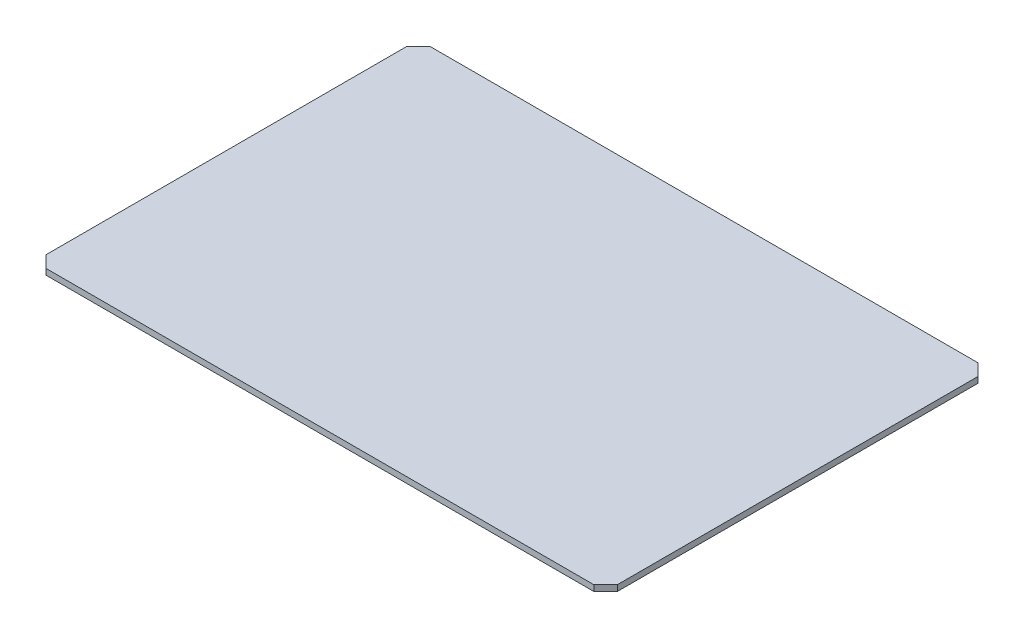
ISO-10303-21;
HEADER;
FILE_DESCRIPTION(('STEP AP214'),'2;1');
FILE_NAME('part.step','',(''),(''),'','','');
FILE_SCHEMA(('AUTOMOTIVE_DESIGN { 1 0 10303 214 1 1 1 1 }'));
ENDSEC;
DATA;
#1=APPLICATION_CONTEXT('core data for automotive mechanical design processes');
#2=APPLICATION_PROTOCOL_DEFINITION('international standard','automotive_design',2000,#1);
#3=PRODUCT_CONTEXT('',#1,'mechanical');
#4=PRODUCT('Part','Part','',(#3));
#5=PRODUCT_RELATED_PRODUCT_CATEGORY('part','',(#4));
#6=PRODUCT_DEFINITION_FORMATION('','',#4);
#7=PRODUCT_DEFINITION_CONTEXT('part definition',#1,'design');
#8=PRODUCT_DEFINITION('design','',#6,#7);
#9=PRODUCT_DEFINITION_SHAPE('','',#8);
#10=(LENGTH_UNIT() NAMED_UNIT(*) SI_UNIT(.MILLI.,.METRE.));
#11=(NAMED_UNIT(*) PLANE_ANGLE_UNIT() SI_UNIT($,.RADIAN.));
#12=(NAMED_UNIT(*) SI_UNIT($,.STERADIAN.) SOLID_ANGLE_UNIT());
#13=UNCERTAINTY_MEASURE_WITH_UNIT(LENGTH_MEASURE(1.E-05),#10,'distance_accuracy_value','');
#14=(GEOMETRIC_REPRESENTATION_CONTEXT(3) GLOBAL_UNCERTAINTY_ASSIGNED_CONTEXT((#13)) GLOBAL_UNIT_ASSIGNED_CONTEXT((#10,
#11,#12)) REPRESENTATION_CONTEXT('',''));
#15=CARTESIAN_POINT('',(0.,0.,0.));
#16=DIRECTION('',(0.,0.,1.));
#17=DIRECTION('',(1.,0.,0.));
#18=AXIS2_PLACEMENT_3D('',#15,#16,#17);
#19=CARTESIAN_POINT('',(0.,3.,0.));
#20=DIRECTION('',(1.,0.,0.));
#21=DIRECTION('',(0.,0.,-1.));
#22=AXIS2_PLACEMENT_3D('',#19,#20,#21);
#23=PLANE('',#22);
#24=DIRECTION('',(0.,0.,1.));
#25=VECTOR('',#24,1.);
#26=CARTESIAN_POINT('',(0.,3.,0.));
#27=LINE('',#26,#25);
#28=CARTESIAN_POINT('',(0.,3.,-189.));
#29=VERTEX_POINT('',#28);
#30=CARTESIAN_POINT('',(0.,3.,-6.00000000000001));
#31=VERTEX_POINT('',#30);
#32=EDGE_CURVE('E126',#29,#31,#27,.T.);
#33=ORIENTED_EDGE('',*,*,#32,.F.);
#34=DIRECTION('',(0.,-1.,0.));
#35=VECTOR('',#34,1.);
#36=CARTESIAN_POINT('',(0.,3.,-189.));
#37=LINE('',#36,#35);
#38=CARTESIAN_POINT('',(0.,0.,-189.));
#39=VERTEX_POINT('',#38);
#40=EDGE_CURVE('E152',#29,#39,#37,.T.);
#41=ORIENTED_EDGE('',*,*,#40,.T.);
#42=DIRECTION('',(0.,0.,1.));
#43=VECTOR('',#42,1.);
#44=CARTESIAN_POINT('',(0.,0.,0.));
#45=LINE('',#44,#43);
#46=CARTESIAN_POINT('',(0.,0.,-6.00000000000001));
#47=VERTEX_POINT('',#46);
#48=EDGE_CURVE('E160',#39,#47,#45,.T.);
#49=ORIENTED_EDGE('',*,*,#48,.T.);
#50=DIRECTION('',(0.,1.,0.));
#51=VECTOR('',#50,1.);
#52=CARTESIAN_POINT('',(0.,3.,-6.00000000000001));
#53=LINE('',#52,#51);
#54=EDGE_CURVE('E150',#47,#31,#53,.T.);
#55=ORIENTED_EDGE('',*,*,#54,.T.);
#56=EDGE_LOOP('',(#33,#41,#49,#55));
#57=FACE_BOUND('',#56,.T.);
#58=ADVANCED_FACE('F35',(#57),#23,.F.);
#59=CARTESIAN_POINT('',(0.,3.,0.));
#60=DIRECTION('',(0.,0.,-1.));
#61=DIRECTION('',(-1.,0.,0.));
#62=AXIS2_PLACEMENT_3D('',#59,#60,#61);
#63=PLANE('',#62);
#64=DIRECTION('',(1.,0.,0.));
#65=VECTOR('',#64,1.);
#66=CARTESIAN_POINT('',(0.,0.,0.));
#67=LINE('',#66,#65);
#68=CARTESIAN_POINT('',(5.99999999999998,0.,0.));
#69=VERTEX_POINT('',#68);
#70=CARTESIAN_POINT('',(284.,0.,0.));
#71=VERTEX_POINT('',#70);
#72=EDGE_CURVE('E131',#69,#71,#67,.T.);
#73=ORIENTED_EDGE('',*,*,#72,.T.);
#74=DIRECTION('',(0.,1.,0.));
#75=VECTOR('',#74,1.);
#76=CARTESIAN_POINT('',(284.,3.,0.));
#77=LINE('',#76,#75);
#78=CARTESIAN_POINT('',(284.,3.,0.));
#79=VERTEX_POINT('',#78);
#80=EDGE_CURVE('E11',#71,#79,#77,.T.);
#81=ORIENTED_EDGE('',*,*,#80,.T.);
#82=DIRECTION('',(1.,0.,0.));
#83=VECTOR('',#82,1.);
#84=CARTESIAN_POINT('',(0.,3.,0.));
#85=LINE('',#84,#83);
#86=CARTESIAN_POINT('',(5.99999999999998,3.,0.));
#87=VERTEX_POINT('',#86);
#88=EDGE_CURVE('E129',#87,#79,#85,.T.);
#89=ORIENTED_EDGE('',*,*,#88,.F.);
#90=DIRECTION('',(0.,-1.,0.));
#91=VECTOR('',#90,1.);
#92=CARTESIAN_POINT('',(5.99999999999998,3.,0.));
#93=LINE('',#92,#91);
#94=EDGE_CURVE('E43',#87,#69,#93,.T.);
#95=ORIENTED_EDGE('',*,*,#94,.T.);
#96=EDGE_LOOP('',(#73,#81,#89,#95));
#97=FACE_BOUND('',#96,.T.);
#98=ADVANCED_FACE('F157',(#97),#63,.F.);
#99=CARTESIAN_POINT('',(290.,3.,0.));
#100=DIRECTION('',(-1.,0.,0.));
#101=DIRECTION('',(0.,0.,1.));
#102=AXIS2_PLACEMENT_3D('',#99,#100,#101);
#103=PLANE('',#102);
#104=DIRECTION('',(0.,0.,-1.));
#105=VECTOR('',#104,1.);
#106=CARTESIAN_POINT('',(290.,0.,0.));
#107=LINE('',#106,#105);
#108=CARTESIAN_POINT('',(290.,0.,-6.00000000000009));
#109=VERTEX_POINT('',#108);
#110=CARTESIAN_POINT('',(290.,0.,-189.));
#111=VERTEX_POINT('',#110);
#112=EDGE_CURVE('E127',#109,#111,#107,.T.);
#113=ORIENTED_EDGE('',*,*,#112,.T.);
#114=DIRECTION('',(0.,1.,0.));
#115=VECTOR('',#114,1.);
#116=CARTESIAN_POINT('',(290.,3.,-189.));
#117=LINE('',#116,#115);
#118=CARTESIAN_POINT('',(290.,3.,-189.));
#119=VERTEX_POINT('',#118);
#120=EDGE_CURVE('E105',#111,#119,#117,.T.);
#121=ORIENTED_EDGE('',*,*,#120,.T.);
#122=DIRECTION('',(0.,0.,-1.));
#123=VECTOR('',#122,1.);
#124=CARTESIAN_POINT('',(290.,3.,0.));
#125=LINE('',#124,#123);
#126=CARTESIAN_POINT('',(290.,3.,-6.00000000000003));
#127=VERTEX_POINT('',#126);
#128=EDGE_CURVE('E164',#127,#119,#125,.T.);
#129=ORIENTED_EDGE('',*,*,#128,.F.);
#130=DIRECTION('',(0.,-1.,0.));
#131=VECTOR('',#130,1.);
#132=CARTESIAN_POINT('',(290.,3.,-6.00000000000003));
#133=LINE('',#132,#131);
#134=EDGE_CURVE('E110',#127,#109,#133,.T.);
#135=ORIENTED_EDGE('',*,*,#134,.T.);
#136=EDGE_LOOP('',(#113,#121,#129,#135));
#137=FACE_BOUND('',#136,.T.);
#138=ADVANCED_FACE('F174',(#137),#103,.F.);
#139=CARTESIAN_POINT('',(0.,3.,-195.));
#140=DIRECTION('',(0.,0.,1.));
#141=DIRECTION('',(1.,0.,0.));
#142=AXIS2_PLACEMENT_3D('',#139,#140,#141);
#143=PLANE('',#142);
#144=DIRECTION('',(-1.,0.,0.));
#145=VECTOR('',#144,1.);
#146=CARTESIAN_POINT('',(0.,3.,-195.));
#147=LINE('',#146,#145);
#148=CARTESIAN_POINT('',(284.,3.,-195.));
#149=VERTEX_POINT('',#148);
#150=CARTESIAN_POINT('',(5.99999999999998,3.,-195.));
#151=VERTEX_POINT('',#150);
#152=EDGE_CURVE('E120',#149,#151,#147,.T.);
#153=ORIENTED_EDGE('',*,*,#152,.F.);
#154=DIRECTION('',(0.,-1.,0.));
#155=VECTOR('',#154,1.);
#156=CARTESIAN_POINT('',(284.,3.,-195.));
#157=LINE('',#156,#155);
#158=CARTESIAN_POINT('',(284.,0.,-195.));
#159=VERTEX_POINT('',#158);
#160=EDGE_CURVE('E104',#149,#159,#157,.T.);
#161=ORIENTED_EDGE('',*,*,#160,.T.);
#162=DIRECTION('',(-1.,0.,0.));
#163=VECTOR('',#162,1.);
#164=CARTESIAN_POINT('',(0.,0.,-195.));
#165=LINE('',#164,#163);
#166=CARTESIAN_POINT('',(5.99999999999998,0.,-195.));
#167=VERTEX_POINT('',#166);
#168=EDGE_CURVE('E117',#159,#167,#165,.T.);
#169=ORIENTED_EDGE('',*,*,#168,.T.);
#170=DIRECTION('',(0.,1.,0.));
#171=VECTOR('',#170,1.);
#172=CARTESIAN_POINT('',(5.99999999999998,3.,-195.));
#173=LINE('',#172,#171);
#174=EDGE_CURVE('E122',#167,#151,#173,.T.);
#175=ORIENTED_EDGE('',*,*,#174,.T.);
#176=EDGE_LOOP('',(#153,#161,#169,#175));
#177=FACE_BOUND('',#176,.T.);
#178=ADVANCED_FACE('F116',(#177),#143,.F.);
#179=CARTESIAN_POINT('',(0.,3.,0.));
#180=DIRECTION('',(0.,-1.,0.));
#181=DIRECTION('',(0.,0.,-1.));
#182=AXIS2_PLACEMENT_3D('',#179,#180,#181);
#183=PLANE('',#182);
#184=ORIENTED_EDGE('',*,*,#128,.T.);
#185=DIRECTION('',(0.707106781186549,0.,0.707106781186546));
#186=VECTOR('',#185,1.);
#187=CARTESIAN_POINT('',(284.,3.,-195.));
#188=LINE('',#187,#186);
#189=EDGE_CURVE('E148',#119,#149,#188,.F.);
#190=ORIENTED_EDGE('',*,*,#189,.T.);
#191=ORIENTED_EDGE('',*,*,#152,.T.);
#192=DIRECTION('',(0.707106781186549,0.,-0.707106781186546));
#193=VECTOR('',#192,1.);
#194=CARTESIAN_POINT('',(0.,3.,-189.));
#195=LINE('',#194,#193);
#196=EDGE_CURVE('E146',#151,#29,#195,.F.);
#197=ORIENTED_EDGE('',*,*,#196,.T.);
#198=ORIENTED_EDGE('',*,*,#32,.T.);
#199=DIRECTION('',(-0.707106781186546,0.,-0.707106781186549));
#200=VECTOR('',#199,1.);
#201=CARTESIAN_POINT('',(5.99999999999998,3.,0.));
#202=LINE('',#201,#200);
#203=EDGE_CURVE('E55',#31,#87,#202,.F.);
#204=ORIENTED_EDGE('',*,*,#203,.T.);
#205=ORIENTED_EDGE('',*,*,#88,.T.);
#206=DIRECTION('',(-0.707106781186552,0.,0.707106781186543));
#207=VECTOR('',#206,1.);
#208=CARTESIAN_POINT('',(290.,3.,-6.00000000000003));
#209=LINE('',#208,#207);
#210=EDGE_CURVE('E144',#79,#127,#209,.F.);
#211=ORIENTED_EDGE('',*,*,#210,.T.);
#212=EDGE_LOOP('',(#184,#190,#191,#197,#198,#204,#205,#211));
#213=FACE_BOUND('',#212,.T.);
#214=ADVANCED_FACE('F168',(#213),#183,.F.);
#215=CARTESIAN_POINT('',(0.,0.,0.));
#216=DIRECTION('',(0.,-1.,0.));
#217=DIRECTION('',(0.,0.,-1.));
#218=AXIS2_PLACEMENT_3D('',#215,#216,#217);
#219=PLANE('',#218);
#220=ORIENTED_EDGE('',*,*,#168,.F.);
#221=DIRECTION('',(-0.707106781186549,0.,-0.707106781186546));
#222=VECTOR('',#221,1.);
#223=CARTESIAN_POINT('',(239.499999999999,0.,-239.5));
#224=LINE('',#223,#222);
#225=EDGE_CURVE('E100',#159,#111,#224,.F.);
#226=ORIENTED_EDGE('',*,*,#225,.T.);
#227=ORIENTED_EDGE('',*,*,#112,.F.);
#228=DIRECTION('',(0.707106781186552,0.,-0.707106781186543));
#229=VECTOR('',#228,1.);
#230=CARTESIAN_POINT('',(141.999999999998,0.,142.));
#231=LINE('',#230,#229);
#232=EDGE_CURVE('E137',#109,#71,#231,.F.);
#233=ORIENTED_EDGE('',*,*,#232,.T.);
#234=ORIENTED_EDGE('',*,*,#72,.F.);
#235=DIRECTION('',(0.707106781186546,0.,0.707106781186549));
#236=VECTOR('',#235,1.);
#237=CARTESIAN_POINT('',(3.,0.,-2.99999999999999));
#238=LINE('',#237,#236);
#239=EDGE_CURVE('E121',#69,#47,#238,.F.);
#240=ORIENTED_EDGE('',*,*,#239,.T.);
#241=ORIENTED_EDGE('',*,*,#48,.F.);
#242=DIRECTION('',(-0.707106781186549,0.,0.707106781186546));
#243=VECTOR('',#242,1.);
#244=CARTESIAN_POINT('',(-94.5,0.,-94.5000000000005));
#245=LINE('',#244,#243);
#246=EDGE_CURVE('E111',#39,#167,#245,.F.);
#247=ORIENTED_EDGE('',*,*,#246,.T.);
#248=EDGE_LOOP('',(#220,#226,#227,#233,#234,#240,#241,#247));
#249=FACE_BOUND('',#248,.T.);
#250=ADVANCED_FACE('F124',(#249),#219,.T.);
#251=CARTESIAN_POINT('',(284.,3.,-195.));
#252=DIRECTION('',(-0.707106781186546,0.,0.707106781186549));
#253=DIRECTION('',(0.,-1.,0.));
#254=AXIS2_PLACEMENT_3D('',#251,#252,#253);
#255=PLANE('',#254);
#256=ORIENTED_EDGE('',*,*,#189,.F.);
#257=ORIENTED_EDGE('',*,*,#120,.F.);
#258=ORIENTED_EDGE('',*,*,#225,.F.);
#259=ORIENTED_EDGE('',*,*,#160,.F.);
#260=EDGE_LOOP('',(#256,#257,#258,#259));
#261=FACE_BOUND('',#260,.T.);
#262=ADVANCED_FACE('F103',(#261),#255,.F.);
#263=CARTESIAN_POINT('',(0.,3.,-189.));
#264=DIRECTION('',(0.707106781186546,0.,0.707106781186549));
#265=DIRECTION('',(0.,-1.,0.));
#266=AXIS2_PLACEMENT_3D('',#263,#264,#265);
#267=PLANE('',#266);
#268=ORIENTED_EDGE('',*,*,#196,.F.);
#269=ORIENTED_EDGE('',*,*,#174,.F.);
#270=ORIENTED_EDGE('',*,*,#246,.F.);
#271=ORIENTED_EDGE('',*,*,#40,.F.);
#272=EDGE_LOOP('',(#268,#269,#270,#271));
#273=FACE_BOUND('',#272,.T.);
#274=ADVANCED_FACE('F179',(#273),#267,.F.);
#275=CARTESIAN_POINT('',(290.,3.,-6.00000000000003));
#276=DIRECTION('',(-0.707106781186543,0.,-0.707106781186552));
#277=DIRECTION('',(0.,-1.,0.));
#278=AXIS2_PLACEMENT_3D('',#275,#276,#277);
#279=PLANE('',#278);
#280=ORIENTED_EDGE('',*,*,#210,.F.);
#281=ORIENTED_EDGE('',*,*,#80,.F.);
#282=ORIENTED_EDGE('',*,*,#232,.F.);
#283=ORIENTED_EDGE('',*,*,#134,.F.);
#284=EDGE_LOOP('',(#280,#281,#282,#283));
#285=FACE_BOUND('',#284,.T.);
#286=ADVANCED_FACE('F172',(#285),#279,.F.);
#287=CARTESIAN_POINT('',(5.99999999999998,3.,0.));
#288=DIRECTION('',(0.707106781186549,0.,-0.707106781186546));
#289=DIRECTION('',(0.,-1.,0.));
#290=AXIS2_PLACEMENT_3D('',#287,#288,#289);
#291=PLANE('',#290);
#292=ORIENTED_EDGE('',*,*,#203,.F.);
#293=ORIENTED_EDGE('',*,*,#54,.F.);
#294=ORIENTED_EDGE('',*,*,#239,.F.);
#295=ORIENTED_EDGE('',*,*,#94,.F.);
#296=EDGE_LOOP('',(#292,#293,#294,#295));
#297=FACE_BOUND('',#296,.T.);
#298=ADVANCED_FACE('F37',(#297),#291,.F.);
#299=CLOSED_SHELL('',(#58,#98,#138,#178,#214,#250,#262,#274,#286,#298));
#300=MANIFOLD_SOLID_BREP('B2',#299);
#301=ADVANCED_BREP_SHAPE_REPRESENTATION('',(#18,#300),#14);
#302=SHAPE_DEFINITION_REPRESENTATION(#9,#301);
ENDSEC;
END-ISO-10303-21;
